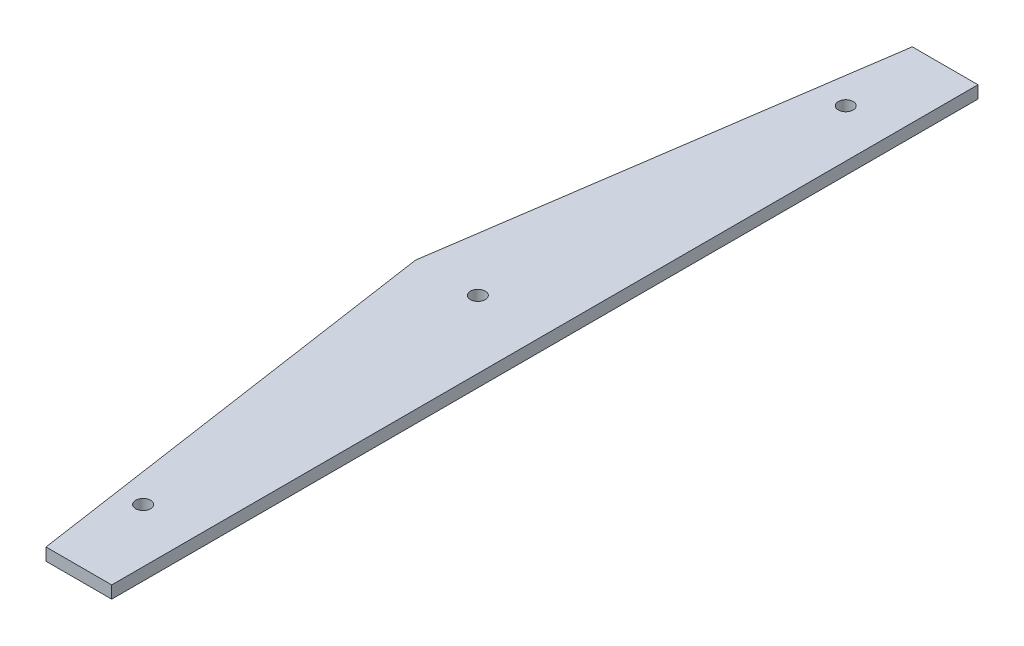
ISO-10303-21;
HEADER;
FILE_DESCRIPTION(('STEP AP214'),'2;1');
FILE_NAME('part.step','',(''),(''),'','','');
FILE_SCHEMA(('AUTOMOTIVE_DESIGN { 1 0 10303 214 1 1 1 1 }'));
ENDSEC;
DATA;
#1=APPLICATION_CONTEXT('core data for automotive mechanical design processes');
#2=APPLICATION_PROTOCOL_DEFINITION('international standard','automotive_design',2000,#1);
#3=PRODUCT_CONTEXT('',#1,'mechanical');
#4=PRODUCT('Part','Part','',(#3));
#5=PRODUCT_RELATED_PRODUCT_CATEGORY('part','',(#4));
#6=PRODUCT_DEFINITION_FORMATION('','',#4);
#7=PRODUCT_DEFINITION_CONTEXT('part definition',#1,'design');
#8=PRODUCT_DEFINITION('design','',#6,#7);
#9=PRODUCT_DEFINITION_SHAPE('','',#8);
#10=(LENGTH_UNIT() NAMED_UNIT(*) SI_UNIT(.MILLI.,.METRE.));
#11=(NAMED_UNIT(*) PLANE_ANGLE_UNIT() SI_UNIT($,.RADIAN.));
#12=(NAMED_UNIT(*) SI_UNIT($,.STERADIAN.) SOLID_ANGLE_UNIT());
#13=UNCERTAINTY_MEASURE_WITH_UNIT(LENGTH_MEASURE(1.E-05),#10,'distance_accuracy_value','');
#14=(GEOMETRIC_REPRESENTATION_CONTEXT(3) GLOBAL_UNCERTAINTY_ASSIGNED_CONTEXT((#13)) GLOBAL_UNIT_ASSIGNED_CONTEXT((#10,
#11,#12)) REPRESENTATION_CONTEXT('',''));
#15=CARTESIAN_POINT('',(0.,0.,0.));
#16=DIRECTION('',(0.,0.,1.));
#17=DIRECTION('',(1.,0.,0.));
#18=AXIS2_PLACEMENT_3D('',#15,#16,#17);
#19=CARTESIAN_POINT('',(-141.516330500068,4.48446008393906,-104.251042846632));
#20=DIRECTION('',(-0.989377136012177,0.,-0.145371533445661));
#21=DIRECTION('',(-0.145371533445661,0.,0.989377136012177));
#22=AXIS2_PLACEMENT_3D('',#19,#20,#21);
#23=PLANE('',#22);
#24=DIRECTION('',(-0.145371533445661,0.,0.989377136012177));
#25=VECTOR('',#24,1.);
#26=CARTESIAN_POINT('',(-141.516330500068,7.65946008393906,-104.251042846632));
#27=LINE('',#26,#25);
#28=CARTESIAN_POINT('',(-141.516330500068,7.65946008393906,-104.251042846632));
#29=VERTEX_POINT('',#28);
#30=CARTESIAN_POINT('',(-157.829549879797,7.65946008393906,6.77431326332184));
#31=VERTEX_POINT('',#30);
#32=EDGE_CURVE('E110',#29,#31,#27,.T.);
#33=ORIENTED_EDGE('',*,*,#32,.F.);
#34=DIRECTION('',(0.,1.,0.));
#35=VECTOR('',#34,1.);
#36=CARTESIAN_POINT('',(-141.516330500068,4.48446008393906,-104.251042846632));
#37=LINE('',#36,#35);
#38=CARTESIAN_POINT('',(-141.516330500068,4.48446008393906,-104.251042846632));
#39=VERTEX_POINT('',#38);
#40=EDGE_CURVE('E11',#39,#29,#37,.T.);
#41=ORIENTED_EDGE('',*,*,#40,.F.);
#42=DIRECTION('',(-0.145371533445661,0.,0.989377136012177));
#43=VECTOR('',#42,1.);
#44=CARTESIAN_POINT('',(-141.516330500068,4.48446008393906,-104.251042846632));
#45=LINE('',#44,#43);
#46=CARTESIAN_POINT('',(-157.829549879797,4.48446008393906,6.77431326332184));
#47=VERTEX_POINT('',#46);
#48=EDGE_CURVE('E105',#39,#47,#45,.T.);
#49=ORIENTED_EDGE('',*,*,#48,.T.);
#50=DIRECTION('',(0.,1.,0.));
#51=VECTOR('',#50,1.);
#52=CARTESIAN_POINT('',(-157.829549879797,4.48446008393906,6.77431326332184));
#53=LINE('',#52,#51);
#54=EDGE_CURVE('E36',#47,#31,#53,.T.);
#55=ORIENTED_EDGE('',*,*,#54,.T.);
#56=EDGE_LOOP('',(#33,#41,#49,#55));
#57=FACE_BOUND('',#56,.T.);
#58=ADVANCED_FACE('F33',(#57),#23,.T.);
#59=CARTESIAN_POINT('',(-141.516330500068,4.48446008393906,-104.251042846632));
#60=DIRECTION('',(0.,0.,-1.));
#61=DIRECTION('',(-1.,0.,0.));
#62=AXIS2_PLACEMENT_3D('',#59,#60,#61);
#63=PLANE('',#62);
#64=DIRECTION('',(-1.,0.,0.));
#65=VECTOR('',#64,1.);
#66=CARTESIAN_POINT('',(-141.516330500068,7.65946008393906,-104.251042846632));
#67=LINE('',#66,#65);
#68=CARTESIAN_POINT('',(-124.671378669894,7.65946008393906,-104.251042846632));
#69=VERTEX_POINT('',#68);
#70=EDGE_CURVE('E120',#69,#29,#67,.T.);
#71=ORIENTED_EDGE('',*,*,#70,.F.);
#72=DIRECTION('',(0.,1.,0.));
#73=VECTOR('',#72,1.);
#74=CARTESIAN_POINT('',(-124.671378669894,4.48446008393906,-104.251042846632));
#75=LINE('',#74,#73);
#76=CARTESIAN_POINT('',(-124.671378669894,4.48446008393906,-104.251042846632));
#77=VERTEX_POINT('',#76);
#78=EDGE_CURVE('E42',#77,#69,#75,.T.);
#79=ORIENTED_EDGE('',*,*,#78,.F.);
#80=DIRECTION('',(-1.,0.,0.));
#81=VECTOR('',#80,1.);
#82=CARTESIAN_POINT('',(-141.516330500068,4.48446008393906,-104.251042846632));
#83=LINE('',#82,#81);
#84=EDGE_CURVE('E100',#77,#39,#83,.T.);
#85=ORIENTED_EDGE('',*,*,#84,.T.);
#86=ORIENTED_EDGE('',*,*,#40,.T.);
#87=EDGE_LOOP('',(#71,#79,#85,#86));
#88=FACE_BOUND('',#87,.T.);
#89=ADVANCED_FACE('F126',(#88),#63,.T.);
#90=CARTESIAN_POINT('',(-124.671378669894,4.48446008393906,-104.251042846632));
#91=DIRECTION('',(1.,0.,0.));
#92=DIRECTION('',(0.,0.,-1.));
#93=AXIS2_PLACEMENT_3D('',#90,#91,#92);
#94=PLANE('',#93);
#95=DIRECTION('',(0.,0.,-1.));
#96=VECTOR('',#95,1.);
#97=CARTESIAN_POINT('',(-124.671378669894,7.65946008393906,-104.251042846632));
#98=LINE('',#97,#96);
#99=CARTESIAN_POINT('',(-124.671378669894,7.65946008393906,117.799669373275));
#100=VERTEX_POINT('',#99);
#101=EDGE_CURVE('E89',#100,#69,#98,.T.);
#102=ORIENTED_EDGE('',*,*,#101,.F.);
#103=DIRECTION('',(0.,1.,0.));
#104=VECTOR('',#103,1.);
#105=CARTESIAN_POINT('',(-124.671378669894,4.48446008393906,117.799669373275));
#106=LINE('',#105,#104);
#107=CARTESIAN_POINT('',(-124.671378669894,4.48446008393906,117.799669373275));
#108=VERTEX_POINT('',#107);
#109=EDGE_CURVE('E84',#108,#100,#106,.T.);
#110=ORIENTED_EDGE('',*,*,#109,.F.);
#111=DIRECTION('',(0.,0.,-1.));
#112=VECTOR('',#111,1.);
#113=CARTESIAN_POINT('',(-124.671378669894,4.48446008393906,-104.251042846632));
#114=LINE('',#113,#112);
#115=EDGE_CURVE('E87',#108,#77,#114,.T.);
#116=ORIENTED_EDGE('',*,*,#115,.T.);
#117=ORIENTED_EDGE('',*,*,#78,.T.);
#118=EDGE_LOOP('',(#102,#110,#116,#117));
#119=FACE_BOUND('',#118,.T.);
#120=ADVANCED_FACE('F86',(#119),#94,.T.);
#121=CARTESIAN_POINT('',(-141.516330500068,4.48446008393906,117.799669373275));
#122=DIRECTION('',(0.,0.,1.));
#123=DIRECTION('',(1.,0.,0.));
#124=AXIS2_PLACEMENT_3D('',#121,#122,#123);
#125=PLANE('',#124);
#126=DIRECTION('',(1.,0.,0.));
#127=VECTOR('',#126,1.);
#128=CARTESIAN_POINT('',(-141.516330500068,7.65946008393906,117.799669373275));
#129=LINE('',#128,#127);
#130=CARTESIAN_POINT('',(-141.516330500068,7.65946008393906,117.799669373275));
#131=VERTEX_POINT('',#130);
#132=EDGE_CURVE('E117',#131,#100,#129,.T.);
#133=ORIENTED_EDGE('',*,*,#132,.F.);
#134=DIRECTION('',(0.,1.,0.));
#135=VECTOR('',#134,1.);
#136=CARTESIAN_POINT('',(-141.516330500068,4.48446008393906,117.799669373275));
#137=LINE('',#136,#135);
#138=CARTESIAN_POINT('',(-141.516330500068,4.48446008393906,117.799669373275));
#139=VERTEX_POINT('',#138);
#140=EDGE_CURVE('E94',#139,#131,#137,.T.);
#141=ORIENTED_EDGE('',*,*,#140,.F.);
#142=DIRECTION('',(1.,0.,0.));
#143=VECTOR('',#142,1.);
#144=CARTESIAN_POINT('',(-141.516330500068,4.48446008393906,117.799669373275));
#145=LINE('',#144,#143);
#146=EDGE_CURVE('E99',#139,#108,#145,.T.);
#147=ORIENTED_EDGE('',*,*,#146,.T.);
#148=ORIENTED_EDGE('',*,*,#109,.T.);
#149=EDGE_LOOP('',(#133,#141,#147,#148));
#150=FACE_BOUND('',#149,.T.);
#151=ADVANCED_FACE('F102',(#150),#125,.T.);
#152=CARTESIAN_POINT('',(-157.829549879797,4.48446008393906,6.77431326332184));
#153=DIRECTION('',(-0.989377136012177,0.,0.145371533445661));
#154=DIRECTION('',(0.145371533445661,0.,0.989377136012177));
#155=AXIS2_PLACEMENT_3D('',#152,#153,#154);
#156=PLANE('',#155);
#157=DIRECTION('',(0.145371533445661,0.,0.989377136012177));
#158=VECTOR('',#157,1.);
#159=CARTESIAN_POINT('',(-157.829549879797,7.65946008393906,6.77431326332184));
#160=LINE('',#159,#158);
#161=EDGE_CURVE('E113',#31,#131,#160,.T.);
#162=ORIENTED_EDGE('',*,*,#161,.F.);
#163=ORIENTED_EDGE('',*,*,#54,.F.);
#164=DIRECTION('',(0.145371533445661,0.,0.989377136012177));
#165=VECTOR('',#164,1.);
#166=CARTESIAN_POINT('',(-157.829549879797,4.48446008393906,6.77431326332184));
#167=LINE('',#166,#165);
#168=EDGE_CURVE('E103',#47,#139,#167,.T.);
#169=ORIENTED_EDGE('',*,*,#168,.T.);
#170=ORIENTED_EDGE('',*,*,#140,.T.);
#171=EDGE_LOOP('',(#162,#163,#169,#170));
#172=FACE_BOUND('',#171,.T.);
#173=ADVANCED_FACE('F123',(#172),#156,.T.);
#174=CARTESIAN_POINT('',(0.,4.48446008393906,0.));
#175=DIRECTION('',(0.,1.,0.));
#176=DIRECTION('',(0.,0.,1.));
#177=AXIS2_PLACEMENT_3D('',#174,#175,#176);
#178=PLANE('',#177);
#179=CARTESIAN_POINT('',(-138.493225998071,4.48446008393906,95.9276806547244));
#180=DIRECTION('',(0.,1.,0.));
#181=DIRECTION('',(0.,0.,1.));
#182=AXIS2_PLACEMENT_3D('',#179,#180,#181);
#183=CIRCLE('',#182,1.89865000000001);
#184=CARTESIAN_POINT('',(-138.493225998071,4.48446008393906,97.8263306547244));
#185=VERTEX_POINT('',#184);
#186=EDGE_CURVE('E165',#185,#185,#183,.T.);
#187=ORIENTED_EDGE('',*,*,#186,.T.);
#188=EDGE_LOOP('',(#187));
#189=FACE_BOUND('',#188,.T.);
#190=CARTESIAN_POINT('',(-142.016337919339,4.48446008393906,6.60864644212911));
#191=DIRECTION('',(0.,1.,0.));
#192=DIRECTION('',(0.,0.,1.));
#193=AXIS2_PLACEMENT_3D('',#190,#191,#192);
#194=CIRCLE('',#193,1.89865000000001);
#195=CARTESIAN_POINT('',(-142.016337919339,4.48446008393906,8.50729644212912));
#196=VERTEX_POINT('',#195);
#197=EDGE_CURVE('E173',#196,#196,#194,.T.);
#198=ORIENTED_EDGE('',*,*,#197,.T.);
#199=EDGE_LOOP('',(#198));
#200=FACE_BOUND('',#199,.T.);
#201=CARTESIAN_POINT('',(-136.956490804567,4.48446008393906,-82.6365222643934));
#202=DIRECTION('',(0.,1.,0.));
#203=DIRECTION('',(0.,0.,1.));
#204=AXIS2_PLACEMENT_3D('',#201,#202,#203);
#205=CIRCLE('',#204,1.89865000000001);
#206=CARTESIAN_POINT('',(-136.956490804567,4.48446008393906,-80.7378722643934));
#207=VERTEX_POINT('',#206);
#208=EDGE_CURVE('E114',#207,#207,#205,.T.);
#209=ORIENTED_EDGE('',*,*,#208,.T.);
#210=EDGE_LOOP('',(#209));
#211=FACE_BOUND('',#210,.T.);
#212=ORIENTED_EDGE('',*,*,#48,.F.);
#213=ORIENTED_EDGE('',*,*,#84,.F.);
#214=ORIENTED_EDGE('',*,*,#115,.F.);
#215=ORIENTED_EDGE('',*,*,#146,.F.);
#216=ORIENTED_EDGE('',*,*,#168,.F.);
#217=EDGE_LOOP('',(#212,#213,#214,#215,#216));
#218=FACE_BOUND('',#217,.T.);
#219=ADVANCED_FACE('F98',(#189,#200,#211,#218),#178,.F.);
#220=CARTESIAN_POINT('',(0.,7.65946008393906,0.));
#221=DIRECTION('',(0.,1.,0.));
#222=DIRECTION('',(0.,0.,1.));
#223=AXIS2_PLACEMENT_3D('',#220,#221,#222);
#224=PLANE('',#223);
#225=CARTESIAN_POINT('',(-138.493225998071,7.65946008393906,95.9276806547244));
#226=DIRECTION('',(0.,1.,0.));
#227=DIRECTION('',(0.,0.,1.));
#228=AXIS2_PLACEMENT_3D('',#225,#226,#227);
#229=CIRCLE('',#228,1.89865000000001);
#230=CARTESIAN_POINT('',(-138.493225998071,7.65946008393906,97.8263306547244));
#231=VERTEX_POINT('',#230);
#232=EDGE_CURVE('E168',#231,#231,#229,.T.);
#233=ORIENTED_EDGE('',*,*,#232,.F.);
#234=EDGE_LOOP('',(#233));
#235=FACE_BOUND('',#234,.T.);
#236=CARTESIAN_POINT('',(-142.016337919339,7.65946008393906,6.60864644212911));
#237=DIRECTION('',(0.,1.,0.));
#238=DIRECTION('',(0.,0.,1.));
#239=AXIS2_PLACEMENT_3D('',#236,#237,#238);
#240=CIRCLE('',#239,1.89865000000001);
#241=CARTESIAN_POINT('',(-142.016337919339,7.65946008393906,8.50729644212912));
#242=VERTEX_POINT('',#241);
#243=EDGE_CURVE('E170',#242,#242,#240,.T.);
#244=ORIENTED_EDGE('',*,*,#243,.F.);
#245=EDGE_LOOP('',(#244));
#246=FACE_BOUND('',#245,.T.);
#247=CARTESIAN_POINT('',(-136.956490804567,7.65946008393906,-82.6365222643934));
#248=DIRECTION('',(0.,1.,0.));
#249=DIRECTION('',(0.,0.,1.));
#250=AXIS2_PLACEMENT_3D('',#247,#248,#249);
#251=CIRCLE('',#250,1.89865000000001);
#252=CARTESIAN_POINT('',(-136.956490804567,7.65946008393906,-80.7378722643934));
#253=VERTEX_POINT('',#252);
#254=EDGE_CURVE('E176',#253,#253,#251,.T.);
#255=ORIENTED_EDGE('',*,*,#254,.F.);
#256=EDGE_LOOP('',(#255));
#257=FACE_BOUND('',#256,.T.);
#258=ORIENTED_EDGE('',*,*,#32,.T.);
#259=ORIENTED_EDGE('',*,*,#161,.T.);
#260=ORIENTED_EDGE('',*,*,#132,.T.);
#261=ORIENTED_EDGE('',*,*,#101,.T.);
#262=ORIENTED_EDGE('',*,*,#70,.T.);
#263=EDGE_LOOP('',(#258,#259,#260,#261,#262));
#264=FACE_BOUND('',#263,.T.);
#265=ADVANCED_FACE('F125',(#235,#246,#257,#264),#224,.T.);
#266=CARTESIAN_POINT('',(-136.956490804567,4.48446008393906,-82.6365222643934));
#267=DIRECTION('',(0.,1.,0.));
#268=DIRECTION('',(0.,0.,1.));
#269=AXIS2_PLACEMENT_3D('',#266,#267,#268);
#270=CYLINDRICAL_SURFACE('',#269,1.89865000000001);
#271=ORIENTED_EDGE('',*,*,#208,.F.);
#272=EDGE_LOOP('',(#271));
#273=FACE_BOUND('',#272,.T.);
#274=ORIENTED_EDGE('',*,*,#254,.T.);
#275=EDGE_LOOP('',(#274));
#276=FACE_BOUND('',#275,.T.);
#277=ADVANCED_FACE('F146',(#273,#276),#270,.F.);
#278=CARTESIAN_POINT('',(-142.016337919339,4.48446008393906,6.60864644212911));
#279=DIRECTION('',(0.,1.,0.));
#280=DIRECTION('',(0.,0.,1.));
#281=AXIS2_PLACEMENT_3D('',#278,#279,#280);
#282=CYLINDRICAL_SURFACE('',#281,1.89865000000001);
#283=ORIENTED_EDGE('',*,*,#197,.F.);
#284=EDGE_LOOP('',(#283));
#285=FACE_BOUND('',#284,.T.);
#286=ORIENTED_EDGE('',*,*,#243,.T.);
#287=EDGE_LOOP('',(#286));
#288=FACE_BOUND('',#287,.T.);
#289=ADVANCED_FACE('F153',(#285,#288),#282,.F.);
#290=CARTESIAN_POINT('',(-138.493225998071,4.48446008393906,95.9276806547244));
#291=DIRECTION('',(0.,1.,0.));
#292=DIRECTION('',(0.,0.,1.));
#293=AXIS2_PLACEMENT_3D('',#290,#291,#292);
#294=CYLINDRICAL_SURFACE('',#293,1.89865000000001);
#295=ORIENTED_EDGE('',*,*,#186,.F.);
#296=EDGE_LOOP('',(#295));
#297=FACE_BOUND('',#296,.T.);
#298=ORIENTED_EDGE('',*,*,#232,.T.);
#299=EDGE_LOOP('',(#298));
#300=FACE_BOUND('',#299,.T.);
#301=ADVANCED_FACE('F157',(#297,#300),#294,.F.);
#302=CLOSED_SHELL('',(#58,#89,#120,#151,#173,#219,#265,#277,#289,#301));
#303=MANIFOLD_SOLID_BREP('B2',#302);
#304=ADVANCED_BREP_SHAPE_REPRESENTATION('',(#18,#303),#14);
#305=SHAPE_DEFINITION_REPRESENTATION(#9,#304);
ENDSEC;
END-ISO-10303-21;
